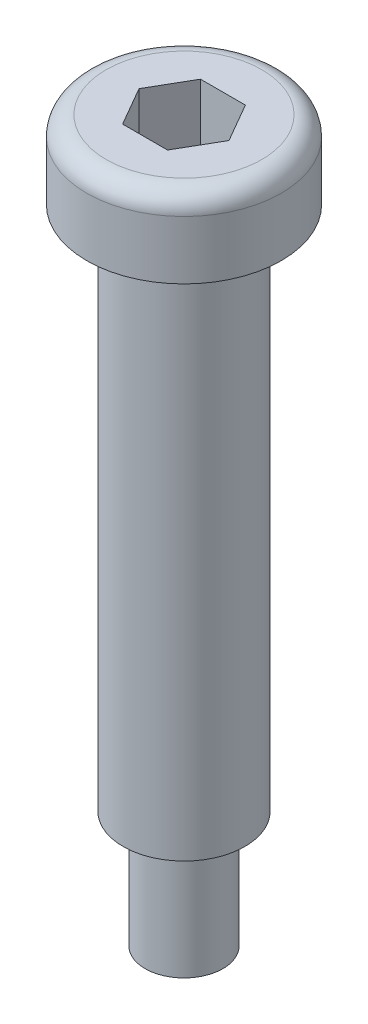
ISO-10303-21;
HEADER;
FILE_DESCRIPTION(('STEP AP214'),'2;1');
FILE_NAME('part.step','',(''),(''),'','','');
FILE_SCHEMA(('AUTOMOTIVE_DESIGN { 1 0 10303 214 1 1 1 1 }'));
ENDSEC;
DATA;
#1=APPLICATION_CONTEXT('core data for automotive mechanical design processes');
#2=APPLICATION_PROTOCOL_DEFINITION('international standard','automotive_design',2000,#1);
#3=PRODUCT_CONTEXT('',#1,'mechanical');
#4=PRODUCT('Part','Part','',(#3));
#5=PRODUCT_RELATED_PRODUCT_CATEGORY('part','',(#4));
#6=PRODUCT_DEFINITION_FORMATION('','',#4);
#7=PRODUCT_DEFINITION_CONTEXT('part definition',#1,'design');
#8=PRODUCT_DEFINITION('design','',#6,#7);
#9=PRODUCT_DEFINITION_SHAPE('','',#8);
#10=(LENGTH_UNIT() NAMED_UNIT(*) SI_UNIT(.MILLI.,.METRE.));
#11=(NAMED_UNIT(*) PLANE_ANGLE_UNIT() SI_UNIT($,.RADIAN.));
#12=(NAMED_UNIT(*) SI_UNIT($,.STERADIAN.) SOLID_ANGLE_UNIT());
#13=UNCERTAINTY_MEASURE_WITH_UNIT(LENGTH_MEASURE(1.E-05),#10,'distance_accuracy_value','');
#14=(GEOMETRIC_REPRESENTATION_CONTEXT(3) GLOBAL_UNCERTAINTY_ASSIGNED_CONTEXT((#13)) GLOBAL_UNIT_ASSIGNED_CONTEXT((#10,
#11,#12)) REPRESENTATION_CONTEXT('',''));
#15=CARTESIAN_POINT('',(0.,0.,0.));
#16=DIRECTION('',(0.,0.,1.));
#17=DIRECTION('',(1.,0.,0.));
#18=AXIS2_PLACEMENT_3D('',#15,#16,#17);
#19=CARTESIAN_POINT('',(0.,0.,0.));
#20=DIRECTION('',(0.,-1.,0.));
#21=DIRECTION('',(1.,0.,0.));
#22=AXIS2_PLACEMENT_3D('',#19,#20,#21);
#23=PLANE('',#22);
#24=CARTESIAN_POINT('',(0.,0.,0.));
#25=DIRECTION('',(0.,1.,0.));
#26=DIRECTION('',(-1.,0.,0.));
#27=AXIS2_PLACEMENT_3D('',#24,#25,#26);
#28=CIRCLE('',#27,2.);
#29=CARTESIAN_POINT('',(-2.,0.,0.));
#30=VERTEX_POINT('',#29);
#31=EDGE_CURVE('E158',#30,#30,#28,.T.);
#32=ORIENTED_EDGE('',*,*,#31,.F.);
#33=EDGE_LOOP('',(#32));
#34=FACE_BOUND('',#33,.T.);
#35=ADVANCED_FACE('F39',(#34),#23,.T.);
#36=CARTESIAN_POINT('',(0.,37.,0.));
#37=DIRECTION('',(0.,1.,0.));
#38=DIRECTION('',(-1.,0.,0.));
#39=AXIS2_PLACEMENT_3D('',#36,#37,#38);
#40=CYLINDRICAL_SURFACE('',#39,2.);
#41=ORIENTED_EDGE('',*,*,#31,.T.);
#42=EDGE_LOOP('',(#41));
#43=FACE_BOUND('',#42,.T.);
#44=CARTESIAN_POINT('',(0.,6.,0.));
#45=DIRECTION('',(0.,1.,0.));
#46=DIRECTION('',(-1.,0.,0.));
#47=AXIS2_PLACEMENT_3D('',#44,#45,#46);
#48=CIRCLE('',#47,2.);
#49=CARTESIAN_POINT('',(-2.,6.,0.));
#50=VERTEX_POINT('',#49);
#51=EDGE_CURVE('E154',#50,#50,#48,.T.);
#52=ORIENTED_EDGE('',*,*,#51,.F.);
#53=EDGE_LOOP('',(#52));
#54=FACE_BOUND('',#53,.T.);
#55=ADVANCED_FACE('F179',(#43,#54),#40,.T.);
#56=CARTESIAN_POINT('',(-2.,6.,0.));
#57=DIRECTION('',(0.,-1.,0.));
#58=DIRECTION('',(1.,0.,0.));
#59=AXIS2_PLACEMENT_3D('',#56,#57,#58);
#60=PLANE('',#59);
#61=ORIENTED_EDGE('',*,*,#51,.T.);
#62=EDGE_LOOP('',(#61));
#63=FACE_BOUND('',#62,.T.);
#64=CARTESIAN_POINT('',(0.,6.,0.));
#65=DIRECTION('',(0.,1.,0.));
#66=DIRECTION('',(-1.,0.,0.));
#67=AXIS2_PLACEMENT_3D('',#64,#65,#66);
#68=CIRCLE('',#67,3.13);
#69=CARTESIAN_POINT('',(-3.13,6.,0.));
#70=VERTEX_POINT('',#69);
#71=EDGE_CURVE('E155',#70,#70,#68,.T.);
#72=ORIENTED_EDGE('',*,*,#71,.F.);
#73=EDGE_LOOP('',(#72));
#74=FACE_BOUND('',#73,.T.);
#75=ADVANCED_FACE('F182',(#63,#74),#60,.T.);
#76=CARTESIAN_POINT('',(0.,37.,0.));
#77=DIRECTION('',(0.,1.,0.));
#78=DIRECTION('',(-1.,0.,0.));
#79=AXIS2_PLACEMENT_3D('',#76,#77,#78);
#80=CYLINDRICAL_SURFACE('',#79,3.13);
#81=ORIENTED_EDGE('',*,*,#71,.T.);
#82=EDGE_LOOP('',(#81));
#83=FACE_BOUND('',#82,.T.);
#84=CARTESIAN_POINT('',(0.,33.,0.));
#85=DIRECTION('',(0.,1.,0.));
#86=DIRECTION('',(-1.,0.,0.));
#87=AXIS2_PLACEMENT_3D('',#84,#85,#86);
#88=CIRCLE('',#87,3.12999999999999);
#89=CARTESIAN_POINT('',(-3.13,33.,0.));
#90=VERTEX_POINT('',#89);
#91=EDGE_CURVE('E149',#90,#90,#88,.T.);
#92=ORIENTED_EDGE('',*,*,#91,.F.);
#93=EDGE_LOOP('',(#92));
#94=FACE_BOUND('',#93,.T.);
#95=ADVANCED_FACE('F189',(#83,#94),#80,.T.);
#96=CARTESIAN_POINT('',(-3.13,33.,0.));
#97=DIRECTION('',(0.,-1.,0.));
#98=DIRECTION('',(1.,0.,0.));
#99=AXIS2_PLACEMENT_3D('',#96,#97,#98);
#100=PLANE('',#99);
#101=ORIENTED_EDGE('',*,*,#91,.T.);
#102=EDGE_LOOP('',(#101));
#103=FACE_BOUND('',#102,.T.);
#104=CARTESIAN_POINT('',(0.,33.,0.));
#105=DIRECTION('',(0.,1.,0.));
#106=DIRECTION('',(-1.,0.,0.));
#107=AXIS2_PLACEMENT_3D('',#104,#105,#106);
#108=CIRCLE('',#107,5.);
#109=CARTESIAN_POINT('',(-5.,33.,0.));
#110=VERTEX_POINT('',#109);
#111=EDGE_CURVE('E143',#110,#110,#108,.T.);
#112=ORIENTED_EDGE('',*,*,#111,.F.);
#113=EDGE_LOOP('',(#112));
#114=FACE_BOUND('',#113,.T.);
#115=ADVANCED_FACE('F191',(#103,#114),#100,.T.);
#116=CARTESIAN_POINT('',(0.,37.,0.));
#117=DIRECTION('',(0.,1.,0.));
#118=DIRECTION('',(-1.,0.,0.));
#119=AXIS2_PLACEMENT_3D('',#116,#117,#118);
#120=CYLINDRICAL_SURFACE('',#119,5.);
#121=CARTESIAN_POINT('',(0.,36.,0.));
#122=DIRECTION('',(0.,1.,0.));
#123=DIRECTION('',(-1.,0.,0.));
#124=AXIS2_PLACEMENT_3D('',#121,#122,#123);
#125=CIRCLE('',#124,5.);
#126=CARTESIAN_POINT('',(-5.,36.,0.));
#127=VERTEX_POINT('',#126);
#128=EDGE_CURVE('E11',#127,#127,#125,.F.);
#129=ORIENTED_EDGE('',*,*,#128,.T.);
#130=EDGE_LOOP('',(#129));
#131=FACE_BOUND('',#130,.T.);
#132=ORIENTED_EDGE('',*,*,#111,.T.);
#133=EDGE_LOOP('',(#132));
#134=FACE_BOUND('',#133,.T.);
#135=ADVANCED_FACE('F198',(#131,#134),#120,.T.);
#136=CARTESIAN_POINT('',(-5.,37.,0.));
#137=DIRECTION('',(0.,1.,0.));
#138=DIRECTION('',(-1.,0.,0.));
#139=AXIS2_PLACEMENT_3D('',#136,#137,#138);
#140=PLANE('',#139);
#141=CARTESIAN_POINT('',(0.,37.,0.));
#142=DIRECTION('',(0.,1.,0.));
#143=DIRECTION('',(-1.,0.,0.));
#144=AXIS2_PLACEMENT_3D('',#141,#142,#143);
#145=CIRCLE('',#144,4.);
#146=CARTESIAN_POINT('',(-4.,37.,0.));
#147=VERTEX_POINT('',#146);
#148=EDGE_CURVE('E50',#147,#147,#145,.T.);
#149=ORIENTED_EDGE('',*,*,#148,.T.);
#150=EDGE_LOOP('',(#149));
#151=FACE_BOUND('',#150,.T.);
#152=DIRECTION('',(0.5,0.,0.866025403784439));
#153=VECTOR('',#152,1.);
#154=CARTESIAN_POINT('',(-2.30940107675851,37.,0.));
#155=LINE('',#154,#153);
#156=CARTESIAN_POINT('',(-2.30940107675851,37.,0.));
#157=VERTEX_POINT('',#156);
#158=CARTESIAN_POINT('',(-1.15470053837925,37.,2.));
#159=VERTEX_POINT('',#158);
#160=EDGE_CURVE('E53',#157,#159,#155,.T.);
#161=ORIENTED_EDGE('',*,*,#160,.F.);
#162=DIRECTION('',(-0.5,0.,0.866025403784439));
#163=VECTOR('',#162,1.);
#164=CARTESIAN_POINT('',(-1.15470053837925,37.,-2.));
#165=LINE('',#164,#163);
#166=CARTESIAN_POINT('',(-1.15470053837925,37.,-2.));
#167=VERTEX_POINT('',#166);
#168=EDGE_CURVE('E136',#167,#157,#165,.T.);
#169=ORIENTED_EDGE('',*,*,#168,.F.);
#170=DIRECTION('',(-1.,0.,0.));
#171=VECTOR('',#170,1.);
#172=CARTESIAN_POINT('',(1.15470053837925,37.,-2.));
#173=LINE('',#172,#171);
#174=CARTESIAN_POINT('',(1.15470053837925,37.,-2.));
#175=VERTEX_POINT('',#174);
#176=EDGE_CURVE('E133',#175,#167,#173,.T.);
#177=ORIENTED_EDGE('',*,*,#176,.F.);
#178=DIRECTION('',(-0.5,0.,-0.866025403784439));
#179=VECTOR('',#178,1.);
#180=CARTESIAN_POINT('',(2.3094010767585,37.,0.));
#181=LINE('',#180,#179);
#182=CARTESIAN_POINT('',(2.3094010767585,37.,0.));
#183=VERTEX_POINT('',#182);
#184=EDGE_CURVE('E105',#183,#175,#181,.T.);
#185=ORIENTED_EDGE('',*,*,#184,.F.);
#186=DIRECTION('',(0.5,0.,-0.866025403784439));
#187=VECTOR('',#186,1.);
#188=CARTESIAN_POINT('',(1.15470053837925,37.,2.));
#189=LINE('',#188,#187);
#190=CARTESIAN_POINT('',(1.15470053837925,37.,2.));
#191=VERTEX_POINT('',#190);
#192=EDGE_CURVE('E132',#191,#183,#189,.T.);
#193=ORIENTED_EDGE('',*,*,#192,.F.);
#194=DIRECTION('',(1.,0.,0.));
#195=VECTOR('',#194,1.);
#196=CARTESIAN_POINT('',(-1.15470053837926,37.,2.));
#197=LINE('',#196,#195);
#198=EDGE_CURVE('E126',#159,#191,#197,.T.);
#199=ORIENTED_EDGE('',*,*,#198,.F.);
#200=EDGE_LOOP('',(#161,#169,#177,#185,#193,#199));
#201=FACE_BOUND('',#200,.T.);
#202=ADVANCED_FACE('F162',(#151,#201),#140,.T.);
#203=CARTESIAN_POINT('',(-2.30940107675851,34.,0.));
#204=DIRECTION('',(-0.866025403784439,0.,0.5));
#205=DIRECTION('',(0.5,0.,0.866025403784439));
#206=AXIS2_PLACEMENT_3D('',#203,#204,#205);
#207=PLANE('',#206);
#208=ORIENTED_EDGE('',*,*,#160,.T.);
#209=DIRECTION('',(0.,1.,0.));
#210=VECTOR('',#209,1.);
#211=CARTESIAN_POINT('',(-1.15470053837925,34.,2.));
#212=LINE('',#211,#210);
#213=CARTESIAN_POINT('',(-1.15470053837925,34.,2.));
#214=VERTEX_POINT('',#213);
#215=EDGE_CURVE('E83',#214,#159,#212,.T.);
#216=ORIENTED_EDGE('',*,*,#215,.F.);
#217=DIRECTION('',(0.5,0.,0.866025403784439));
#218=VECTOR('',#217,1.);
#219=CARTESIAN_POINT('',(-2.30940107675851,34.,0.));
#220=LINE('',#219,#218);
#221=CARTESIAN_POINT('',(-2.30940107675851,34.,0.));
#222=VERTEX_POINT('',#221);
#223=EDGE_CURVE('E138',#222,#214,#220,.T.);
#224=ORIENTED_EDGE('',*,*,#223,.F.);
#225=DIRECTION('',(0.,1.,0.));
#226=VECTOR('',#225,1.);
#227=CARTESIAN_POINT('',(-2.30940107675851,34.,0.));
#228=LINE('',#227,#226);
#229=EDGE_CURVE('E65',#222,#157,#228,.T.);
#230=ORIENTED_EDGE('',*,*,#229,.T.);
#231=EDGE_LOOP('',(#208,#216,#224,#230));
#232=FACE_BOUND('',#231,.T.);
#233=ADVANCED_FACE('F205',(#232),#207,.F.);
#234=CARTESIAN_POINT('',(-1.15470053837925,34.,-2.));
#235=DIRECTION('',(-0.866025403784438,0.,-0.5));
#236=DIRECTION('',(-0.5,0.,0.866025403784439));
#237=AXIS2_PLACEMENT_3D('',#234,#235,#236);
#238=PLANE('',#237);
#239=ORIENTED_EDGE('',*,*,#168,.T.);
#240=ORIENTED_EDGE('',*,*,#229,.F.);
#241=DIRECTION('',(-0.5,0.,0.866025403784439));
#242=VECTOR('',#241,1.);
#243=CARTESIAN_POINT('',(-1.15470053837925,34.,-2.));
#244=LINE('',#243,#242);
#245=CARTESIAN_POINT('',(-1.15470053837925,34.,-2.));
#246=VERTEX_POINT('',#245);
#247=EDGE_CURVE('E111',#246,#222,#244,.T.);
#248=ORIENTED_EDGE('',*,*,#247,.F.);
#249=DIRECTION('',(0.,1.,0.));
#250=VECTOR('',#249,1.);
#251=CARTESIAN_POINT('',(-1.15470053837925,34.,-2.));
#252=LINE('',#251,#250);
#253=EDGE_CURVE('E106',#246,#167,#252,.T.);
#254=ORIENTED_EDGE('',*,*,#253,.T.);
#255=EDGE_LOOP('',(#239,#240,#248,#254));
#256=FACE_BOUND('',#255,.T.);
#257=ADVANCED_FACE('F202',(#256),#238,.F.);
#258=CARTESIAN_POINT('',(1.15470053837925,34.,-2.));
#259=DIRECTION('',(0.,0.,-1.));
#260=DIRECTION('',(-1.,0.,0.));
#261=AXIS2_PLACEMENT_3D('',#258,#259,#260);
#262=PLANE('',#261);
#263=ORIENTED_EDGE('',*,*,#176,.T.);
#264=ORIENTED_EDGE('',*,*,#253,.F.);
#265=DIRECTION('',(-1.,0.,0.));
#266=VECTOR('',#265,1.);
#267=CARTESIAN_POINT('',(1.15470053837925,34.,-2.));
#268=LINE('',#267,#266);
#269=CARTESIAN_POINT('',(1.15470053837925,34.,-2.));
#270=VERTEX_POINT('',#269);
#271=EDGE_CURVE('E109',#270,#246,#268,.T.);
#272=ORIENTED_EDGE('',*,*,#271,.F.);
#273=DIRECTION('',(0.,1.,0.));
#274=VECTOR('',#273,1.);
#275=CARTESIAN_POINT('',(1.15470053837925,34.,-2.));
#276=LINE('',#275,#274);
#277=EDGE_CURVE('E92',#270,#175,#276,.T.);
#278=ORIENTED_EDGE('',*,*,#277,.T.);
#279=EDGE_LOOP('',(#263,#264,#272,#278));
#280=FACE_BOUND('',#279,.T.);
#281=ADVANCED_FACE('F112',(#280),#262,.F.);
#282=CARTESIAN_POINT('',(2.3094010767585,34.,0.));
#283=DIRECTION('',(0.866025403784439,0.,-0.5));
#284=DIRECTION('',(-0.5,0.,-0.866025403784439));
#285=AXIS2_PLACEMENT_3D('',#282,#283,#284);
#286=PLANE('',#285);
#287=ORIENTED_EDGE('',*,*,#184,.T.);
#288=ORIENTED_EDGE('',*,*,#277,.F.);
#289=DIRECTION('',(-0.5,0.,-0.866025403784439));
#290=VECTOR('',#289,1.);
#291=CARTESIAN_POINT('',(2.3094010767585,34.,0.));
#292=LINE('',#291,#290);
#293=CARTESIAN_POINT('',(2.3094010767585,34.,0.));
#294=VERTEX_POINT('',#293);
#295=EDGE_CURVE('E97',#294,#270,#292,.T.);
#296=ORIENTED_EDGE('',*,*,#295,.F.);
#297=DIRECTION('',(0.,1.,0.));
#298=VECTOR('',#297,1.);
#299=CARTESIAN_POINT('',(2.3094010767585,34.,0.));
#300=LINE('',#299,#298);
#301=EDGE_CURVE('E110',#294,#183,#300,.T.);
#302=ORIENTED_EDGE('',*,*,#301,.T.);
#303=EDGE_LOOP('',(#287,#288,#296,#302));
#304=FACE_BOUND('',#303,.T.);
#305=ADVANCED_FACE('F100',(#304),#286,.F.);
#306=CARTESIAN_POINT('',(1.15470053837925,34.,2.));
#307=DIRECTION('',(0.866025403784439,0.,0.5));
#308=DIRECTION('',(0.5,0.,-0.866025403784439));
#309=AXIS2_PLACEMENT_3D('',#306,#307,#308);
#310=PLANE('',#309);
#311=ORIENTED_EDGE('',*,*,#192,.T.);
#312=ORIENTED_EDGE('',*,*,#301,.F.);
#313=DIRECTION('',(0.5,0.,-0.866025403784439));
#314=VECTOR('',#313,1.);
#315=CARTESIAN_POINT('',(1.15470053837925,34.,2.));
#316=LINE('',#315,#314);
#317=CARTESIAN_POINT('',(1.15470053837925,34.,2.));
#318=VERTEX_POINT('',#317);
#319=EDGE_CURVE('E118',#318,#294,#316,.T.);
#320=ORIENTED_EDGE('',*,*,#319,.F.);
#321=DIRECTION('',(0.,1.,0.));
#322=VECTOR('',#321,1.);
#323=CARTESIAN_POINT('',(1.15470053837925,34.,2.));
#324=LINE('',#323,#322);
#325=EDGE_CURVE('E145',#318,#191,#324,.T.);
#326=ORIENTED_EDGE('',*,*,#325,.T.);
#327=EDGE_LOOP('',(#311,#312,#320,#326));
#328=FACE_BOUND('',#327,.T.);
#329=ADVANCED_FACE('F208',(#328),#310,.F.);
#330=CARTESIAN_POINT('',(-1.15470053837925,34.,2.));
#331=DIRECTION('',(0.,0.,1.));
#332=DIRECTION('',(1.,0.,0.));
#333=AXIS2_PLACEMENT_3D('',#330,#331,#332);
#334=PLANE('',#333);
#335=ORIENTED_EDGE('',*,*,#198,.T.);
#336=ORIENTED_EDGE('',*,*,#325,.F.);
#337=DIRECTION('',(1.,0.,0.));
#338=VECTOR('',#337,1.);
#339=CARTESIAN_POINT('',(-1.15470053837925,34.,2.));
#340=LINE('',#339,#338);
#341=EDGE_CURVE('E121',#214,#318,#340,.T.);
#342=ORIENTED_EDGE('',*,*,#341,.F.);
#343=ORIENTED_EDGE('',*,*,#215,.T.);
#344=EDGE_LOOP('',(#335,#336,#342,#343));
#345=FACE_BOUND('',#344,.T.);
#346=ADVANCED_FACE('F175',(#345),#334,.F.);
#347=CARTESIAN_POINT('',(0.,34.,0.));
#348=DIRECTION('',(0.,1.,0.));
#349=DIRECTION('',(0.,0.,1.));
#350=AXIS2_PLACEMENT_3D('',#347,#348,#349);
#351=PLANE('',#350);
#352=ORIENTED_EDGE('',*,*,#223,.T.);
#353=ORIENTED_EDGE('',*,*,#341,.T.);
#354=ORIENTED_EDGE('',*,*,#319,.T.);
#355=ORIENTED_EDGE('',*,*,#295,.T.);
#356=ORIENTED_EDGE('',*,*,#271,.T.);
#357=ORIENTED_EDGE('',*,*,#247,.T.);
#358=EDGE_LOOP('',(#352,#353,#354,#355,#356,#357));
#359=FACE_BOUND('',#358,.T.);
#360=ADVANCED_FACE('F120',(#359),#351,.T.);
#361=CARTESIAN_POINT('',(0.,36.,0.));
#362=DIRECTION('',(0.,1.,0.));
#363=DIRECTION('',(-1.,0.,0.));
#364=AXIS2_PLACEMENT_3D('',#361,#362,#363);
#365=TOROIDAL_SURFACE('',#364,4.,1.);
#366=ORIENTED_EDGE('',*,*,#128,.F.);
#367=EDGE_LOOP('',(#366));
#368=FACE_BOUND('',#367,.T.);
#369=ORIENTED_EDGE('',*,*,#148,.F.);
#370=EDGE_LOOP('',(#369));
#371=FACE_BOUND('',#370,.T.);
#372=ADVANCED_FACE('F41',(#368,#371),#365,.T.);
#373=CLOSED_SHELL('',(#35,#55,#75,#95,#115,#135,#202,#233,#257,#281,#305,#329,#346,#360,#372));
#374=MANIFOLD_SOLID_BREP('B2',#373);
#375=ADVANCED_BREP_SHAPE_REPRESENTATION('',(#18,#374),#14);
#376=SHAPE_DEFINITION_REPRESENTATION(#9,#375);
ENDSEC;
END-ISO-10303-21;
